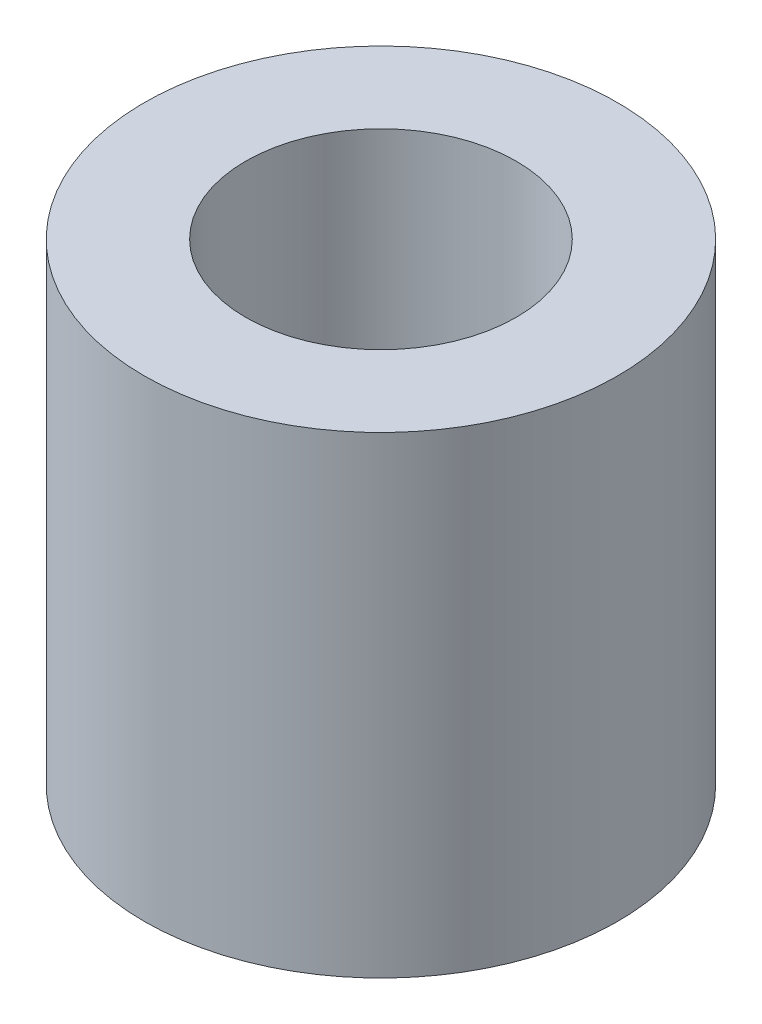
ISO-10303-21;
HEADER;
FILE_DESCRIPTION(('STEP AP214'),'2;1');
FILE_NAME('part.step','',(''),(''),'','','');
FILE_SCHEMA(('AUTOMOTIVE_DESIGN { 1 0 10303 214 1 1 1 1 }'));
ENDSEC;
DATA;
#1=APPLICATION_CONTEXT('core data for automotive mechanical design processes');
#2=APPLICATION_PROTOCOL_DEFINITION('international standard','automotive_design',2000,#1);
#3=PRODUCT_CONTEXT('',#1,'mechanical');
#4=PRODUCT('Part','Part','',(#3));
#5=PRODUCT_RELATED_PRODUCT_CATEGORY('part','',(#4));
#6=PRODUCT_DEFINITION_FORMATION('','',#4);
#7=PRODUCT_DEFINITION_CONTEXT('part definition',#1,'design');
#8=PRODUCT_DEFINITION('design','',#6,#7);
#9=PRODUCT_DEFINITION_SHAPE('','',#8);
#10=(LENGTH_UNIT() NAMED_UNIT(*) SI_UNIT(.MILLI.,.METRE.));
#11=(NAMED_UNIT(*) PLANE_ANGLE_UNIT() SI_UNIT($,.RADIAN.));
#12=(NAMED_UNIT(*) SI_UNIT($,.STERADIAN.) SOLID_ANGLE_UNIT());
#13=UNCERTAINTY_MEASURE_WITH_UNIT(LENGTH_MEASURE(1.E-05),#10,'distance_accuracy_value','');
#14=(GEOMETRIC_REPRESENTATION_CONTEXT(3) GLOBAL_UNCERTAINTY_ASSIGNED_CONTEXT((#13)) GLOBAL_UNIT_ASSIGNED_CONTEXT((#10,
#11,#12)) REPRESENTATION_CONTEXT('',''));
#15=CARTESIAN_POINT('',(0.,0.,0.));
#16=DIRECTION('',(0.,0.,1.));
#17=DIRECTION('',(1.,0.,0.));
#18=AXIS2_PLACEMENT_3D('',#15,#16,#17);
#19=CARTESIAN_POINT('',(0.,10.65,0.));
#20=DIRECTION('',(0.,1.,0.));
#21=DIRECTION('',(0.,0.,1.));
#22=AXIS2_PLACEMENT_3D('',#19,#20,#21);
#23=PLANE('',#22);
#24=CARTESIAN_POINT('',(0.,10.65,0.));
#25=DIRECTION('',(0.,1.,0.));
#26=DIRECTION('',(0.,0.,1.));
#27=AXIS2_PLACEMENT_3D('',#24,#25,#26);
#28=CIRCLE('',#27,5.335);
#29=CARTESIAN_POINT('',(0.,10.65,5.335));
#30=VERTEX_POINT('',#29);
#31=EDGE_CURVE('E10',#30,#30,#28,.T.);
#32=ORIENTED_EDGE('',*,*,#31,.T.);
#33=EDGE_LOOP('',(#32));
#34=FACE_BOUND('',#33,.T.);
#35=CARTESIAN_POINT('',(0.,10.65,0.));
#36=DIRECTION('',(0.,1.,0.));
#37=DIRECTION('',(0.,0.,1.));
#38=AXIS2_PLACEMENT_3D('',#35,#36,#37);
#39=CIRCLE('',#38,3.05);
#40=CARTESIAN_POINT('',(0.,10.65,3.05));
#41=VERTEX_POINT('',#40);
#42=EDGE_CURVE('E42',#41,#41,#39,.T.);
#43=ORIENTED_EDGE('',*,*,#42,.F.);
#44=EDGE_LOOP('',(#43));
#45=FACE_BOUND('',#44,.T.);
#46=ADVANCED_FACE('F31',(#34,#45),#23,.T.);
#47=CARTESIAN_POINT('',(0.,0.,0.));
#48=DIRECTION('',(0.,1.,0.));
#49=DIRECTION('',(0.,0.,1.));
#50=AXIS2_PLACEMENT_3D('',#47,#48,#49);
#51=PLANE('',#50);
#52=CARTESIAN_POINT('',(0.,0.,0.));
#53=DIRECTION('',(0.,1.,0.));
#54=DIRECTION('',(0.,0.,1.));
#55=AXIS2_PLACEMENT_3D('',#52,#53,#54);
#56=CIRCLE('',#55,5.335);
#57=CARTESIAN_POINT('',(0.,0.,5.335));
#58=VERTEX_POINT('',#57);
#59=EDGE_CURVE('E35',#58,#58,#56,.T.);
#60=ORIENTED_EDGE('',*,*,#59,.F.);
#61=EDGE_LOOP('',(#60));
#62=FACE_BOUND('',#61,.T.);
#63=CARTESIAN_POINT('',(0.,0.,0.));
#64=DIRECTION('',(0.,1.,0.));
#65=DIRECTION('',(0.,0.,1.));
#66=AXIS2_PLACEMENT_3D('',#63,#64,#65);
#67=CIRCLE('',#66,3.05);
#68=CARTESIAN_POINT('',(0.,0.,3.05));
#69=VERTEX_POINT('',#68);
#70=EDGE_CURVE('E44',#69,#69,#67,.T.);
#71=ORIENTED_EDGE('',*,*,#70,.T.);
#72=EDGE_LOOP('',(#71));
#73=FACE_BOUND('',#72,.T.);
#74=ADVANCED_FACE('F54',(#62,#73),#51,.F.);
#75=CARTESIAN_POINT('',(0.,10.65,0.));
#76=DIRECTION('',(0.,-1.,0.));
#77=DIRECTION('',(0.,0.,-1.));
#78=AXIS2_PLACEMENT_3D('',#75,#76,#77);
#79=CYLINDRICAL_SURFACE('',#78,5.335);
#80=ORIENTED_EDGE('',*,*,#31,.F.);
#81=EDGE_LOOP('',(#80));
#82=FACE_BOUND('',#81,.T.);
#83=ORIENTED_EDGE('',*,*,#59,.T.);
#84=EDGE_LOOP('',(#83));
#85=FACE_BOUND('',#84,.T.);
#86=ADVANCED_FACE('F33',(#82,#85),#79,.T.);
#87=CARTESIAN_POINT('',(0.,10.65,0.));
#88=DIRECTION('',(0.,-1.,0.));
#89=DIRECTION('',(0.,0.,-1.));
#90=AXIS2_PLACEMENT_3D('',#87,#88,#89);
#91=CYLINDRICAL_SURFACE('',#90,3.05);
#92=ORIENTED_EDGE('',*,*,#42,.T.);
#93=EDGE_LOOP('',(#92));
#94=FACE_BOUND('',#93,.T.);
#95=ORIENTED_EDGE('',*,*,#70,.F.);
#96=EDGE_LOOP('',(#95));
#97=FACE_BOUND('',#96,.T.);
#98=ADVANCED_FACE('F50',(#94,#97),#91,.F.);
#99=CLOSED_SHELL('',(#46,#74,#86,#98));
#100=MANIFOLD_SOLID_BREP('B2',#99);
#101=ADVANCED_BREP_SHAPE_REPRESENTATION('',(#18,#100),#14);
#102=SHAPE_DEFINITION_REPRESENTATION(#9,#101);
ENDSEC;
END-ISO-10303-21;
